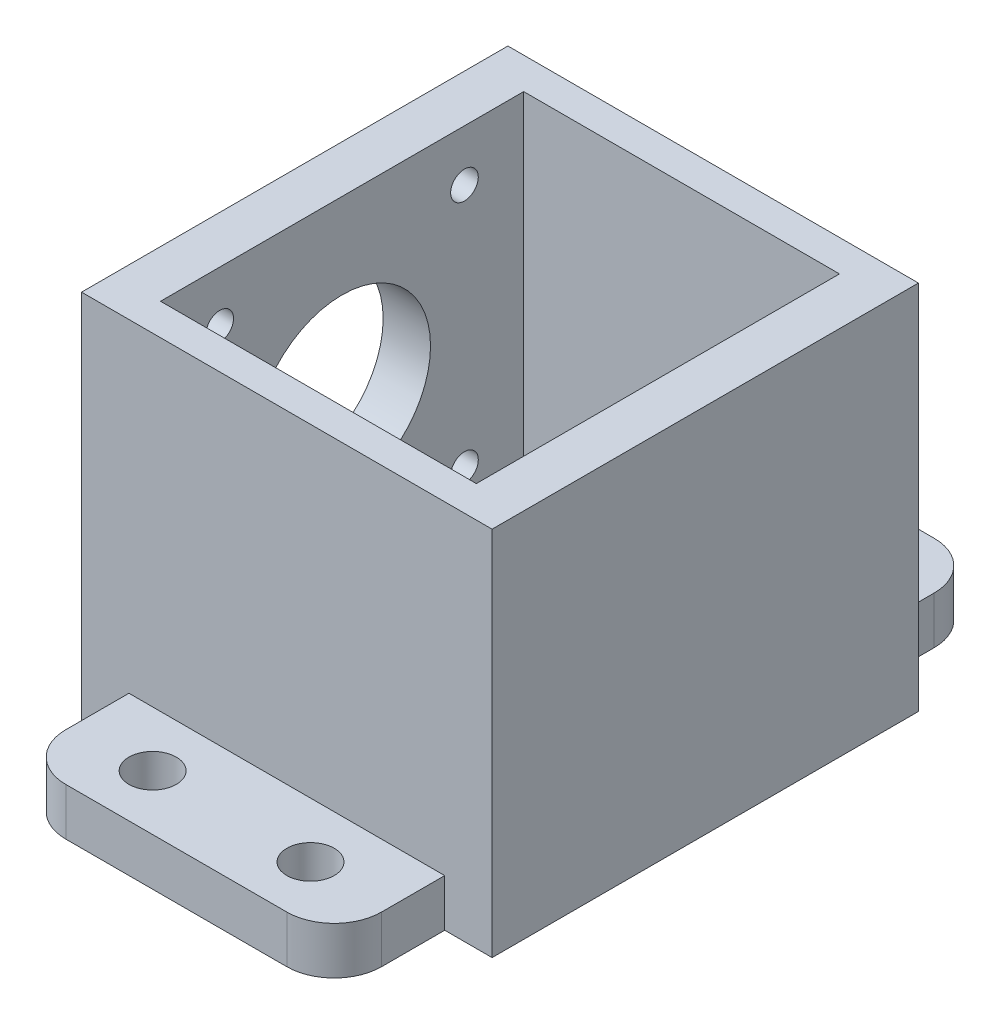
ISO-10303-21;
HEADER;
FILE_DESCRIPTION(('STEP AP214'),'2;1');
FILE_NAME('part.step','',(''),(''),'','','');
FILE_SCHEMA(('AUTOMOTIVE_DESIGN { 1 0 10303 214 1 1 1 1 }'));
ENDSEC;
DATA;
#1=APPLICATION_CONTEXT('core data for automotive mechanical design processes');
#2=APPLICATION_PROTOCOL_DEFINITION('international standard','automotive_design',2000,#1);
#3=PRODUCT_CONTEXT('',#1,'mechanical');
#4=PRODUCT('Part','Part','',(#3));
#5=PRODUCT_RELATED_PRODUCT_CATEGORY('part','',(#4));
#6=PRODUCT_DEFINITION_FORMATION('','',#4);
#7=PRODUCT_DEFINITION_CONTEXT('part definition',#1,'design');
#8=PRODUCT_DEFINITION('design','',#6,#7);
#9=PRODUCT_DEFINITION_SHAPE('','',#8);
#10=(LENGTH_UNIT() NAMED_UNIT(*) SI_UNIT(.MILLI.,.METRE.));
#11=(NAMED_UNIT(*) PLANE_ANGLE_UNIT() SI_UNIT($,.RADIAN.));
#12=(NAMED_UNIT(*) SI_UNIT($,.STERADIAN.) SOLID_ANGLE_UNIT());
#13=UNCERTAINTY_MEASURE_WITH_UNIT(LENGTH_MEASURE(1.E-05),#10,'distance_accuracy_value','');
#14=(GEOMETRIC_REPRESENTATION_CONTEXT(3) GLOBAL_UNCERTAINTY_ASSIGNED_CONTEXT((#13)) GLOBAL_UNIT_ASSIGNED_CONTEXT((#10,
#11,#12)) REPRESENTATION_CONTEXT('',''));
#15=CARTESIAN_POINT('',(0.,0.,0.));
#16=DIRECTION('',(0.,0.,1.));
#17=DIRECTION('',(1.,0.,0.));
#18=AXIS2_PLACEMENT_3D('',#15,#16,#17);
#19=CARTESIAN_POINT('',(-26.,47.,27.));
#20=DIRECTION('',(0.,0.,-1.));
#21=DIRECTION('',(-1.,0.,0.));
#22=AXIS2_PLACEMENT_3D('',#19,#20,#21);
#23=PLANE('',#22);
#24=DIRECTION('',(0.,-1.,0.));
#25=VECTOR('',#24,1.);
#26=CARTESIAN_POINT('',(-20.,6.,27.));
#27=LINE('',#26,#25);
#28=CARTESIAN_POINT('',(-20.,6.,27.));
#29=VERTEX_POINT('',#28);
#30=CARTESIAN_POINT('',(-20.,0.,27.));
#31=VERTEX_POINT('',#30);
#32=EDGE_CURVE('E197',#29,#31,#27,.T.);
#33=ORIENTED_EDGE('',*,*,#32,.F.);
#34=DIRECTION('',(-1.,0.,0.));
#35=VECTOR('',#34,1.);
#36=CARTESIAN_POINT('',(-20.,6.,27.));
#37=LINE('',#36,#35);
#38=CARTESIAN_POINT('',(20.,6.,27.));
#39=VERTEX_POINT('',#38);
#40=EDGE_CURVE('E180',#39,#29,#37,.T.);
#41=ORIENTED_EDGE('',*,*,#40,.F.);
#42=DIRECTION('',(0.,-1.,0.));
#43=VECTOR('',#42,1.);
#44=CARTESIAN_POINT('',(20.,6.,27.));
#45=LINE('',#44,#43);
#46=CARTESIAN_POINT('',(20.,0.,27.));
#47=VERTEX_POINT('',#46);
#48=EDGE_CURVE('E190',#39,#47,#45,.T.);
#49=ORIENTED_EDGE('',*,*,#48,.T.);
#50=DIRECTION('',(1.,0.,0.));
#51=VECTOR('',#50,1.);
#52=CARTESIAN_POINT('',(-26.,0.,27.));
#53=LINE('',#52,#51);
#54=CARTESIAN_POINT('',(26.,0.,27.));
#55=VERTEX_POINT('',#54);
#56=EDGE_CURVE('E321',#47,#55,#53,.T.);
#57=ORIENTED_EDGE('',*,*,#56,.T.);
#58=DIRECTION('',(0.,-1.,0.));
#59=VECTOR('',#58,1.);
#60=CARTESIAN_POINT('',(26.,47.,27.));
#61=LINE('',#60,#59);
#62=CARTESIAN_POINT('',(26.,47.,27.));
#63=VERTEX_POINT('',#62);
#64=EDGE_CURVE('E334',#63,#55,#61,.T.);
#65=ORIENTED_EDGE('',*,*,#64,.F.);
#66=DIRECTION('',(1.,0.,0.));
#67=VECTOR('',#66,1.);
#68=CARTESIAN_POINT('',(-26.,47.,27.));
#69=LINE('',#68,#67);
#70=CARTESIAN_POINT('',(-26.,47.,27.));
#71=VERTEX_POINT('',#70);
#72=EDGE_CURVE('E311',#71,#63,#69,.T.);
#73=ORIENTED_EDGE('',*,*,#72,.F.);
#74=DIRECTION('',(0.,-1.,0.));
#75=VECTOR('',#74,1.);
#76=CARTESIAN_POINT('',(-26.,47.,27.));
#77=LINE('',#76,#75);
#78=CARTESIAN_POINT('',(-26.,0.,27.));
#79=VERTEX_POINT('',#78);
#80=EDGE_CURVE('E337',#71,#79,#77,.T.);
#81=ORIENTED_EDGE('',*,*,#80,.T.);
#82=EDGE_CURVE('E322',#79,#31,#53,.T.);
#83=ORIENTED_EDGE('',*,*,#82,.T.);
#84=EDGE_LOOP('',(#33,#41,#49,#57,#65,#73,#81,#83));
#85=FACE_BOUND('',#84,.T.);
#86=ADVANCED_FACE('F35',(#85),#23,.F.);
#87=CARTESIAN_POINT('',(-26.,47.,-27.));
#88=DIRECTION('',(0.,0.,1.));
#89=DIRECTION('',(1.,0.,0.));
#90=AXIS2_PLACEMENT_3D('',#87,#88,#89);
#91=PLANE('',#90);
#92=DIRECTION('',(0.,-1.,0.));
#93=VECTOR('',#92,1.);
#94=CARTESIAN_POINT('',(20.,6.,-27.));
#95=LINE('',#94,#93);
#96=CARTESIAN_POINT('',(20.,6.,-27.));
#97=VERTEX_POINT('',#96);
#98=CARTESIAN_POINT('',(20.,0.,-27.));
#99=VERTEX_POINT('',#98);
#100=EDGE_CURVE('E235',#97,#99,#95,.T.);
#101=ORIENTED_EDGE('',*,*,#100,.F.);
#102=DIRECTION('',(1.,0.,0.));
#103=VECTOR('',#102,1.);
#104=CARTESIAN_POINT('',(-20.,6.,-27.));
#105=LINE('',#104,#103);
#106=CARTESIAN_POINT('',(-20.,6.,-27.));
#107=VERTEX_POINT('',#106);
#108=EDGE_CURVE('E228',#107,#97,#105,.T.);
#109=ORIENTED_EDGE('',*,*,#108,.F.);
#110=DIRECTION('',(0.,-1.,0.));
#111=VECTOR('',#110,1.);
#112=CARTESIAN_POINT('',(-20.,6.,-27.));
#113=LINE('',#112,#111);
#114=CARTESIAN_POINT('',(-20.,0.,-27.));
#115=VERTEX_POINT('',#114);
#116=EDGE_CURVE('E242',#107,#115,#113,.T.);
#117=ORIENTED_EDGE('',*,*,#116,.T.);
#118=DIRECTION('',(-1.,0.,0.));
#119=VECTOR('',#118,1.);
#120=CARTESIAN_POINT('',(-26.,0.,-27.));
#121=LINE('',#120,#119);
#122=CARTESIAN_POINT('',(-26.,0.,-27.));
#123=VERTEX_POINT('',#122);
#124=EDGE_CURVE('E326',#115,#123,#121,.T.);
#125=ORIENTED_EDGE('',*,*,#124,.T.);
#126=DIRECTION('',(0.,-1.,0.));
#127=VECTOR('',#126,1.);
#128=CARTESIAN_POINT('',(-26.,47.,-27.));
#129=LINE('',#128,#127);
#130=CARTESIAN_POINT('',(-26.,47.,-27.));
#131=VERTEX_POINT('',#130);
#132=EDGE_CURVE('E318',#131,#123,#129,.T.);
#133=ORIENTED_EDGE('',*,*,#132,.F.);
#134=DIRECTION('',(-1.,0.,0.));
#135=VECTOR('',#134,1.);
#136=CARTESIAN_POINT('',(-26.,47.,-27.));
#137=LINE('',#136,#135);
#138=CARTESIAN_POINT('',(26.,47.,-27.));
#139=VERTEX_POINT('',#138);
#140=EDGE_CURVE('E316',#139,#131,#137,.T.);
#141=ORIENTED_EDGE('',*,*,#140,.F.);
#142=DIRECTION('',(0.,-1.,0.));
#143=VECTOR('',#142,1.);
#144=CARTESIAN_POINT('',(26.,47.,-27.));
#145=LINE('',#144,#143);
#146=CARTESIAN_POINT('',(26.,0.,-27.));
#147=VERTEX_POINT('',#146);
#148=EDGE_CURVE('E331',#139,#147,#145,.T.);
#149=ORIENTED_EDGE('',*,*,#148,.T.);
#150=EDGE_CURVE('E312',#147,#99,#121,.T.);
#151=ORIENTED_EDGE('',*,*,#150,.T.);
#152=EDGE_LOOP('',(#101,#109,#117,#125,#133,#141,#149,#151));
#153=FACE_BOUND('',#152,.T.);
#154=ADVANCED_FACE('F383',(#153),#91,.F.);
#155=CARTESIAN_POINT('',(-26.,47.,27.));
#156=DIRECTION('',(1.,0.,0.));
#157=DIRECTION('',(0.,0.,-1.));
#158=AXIS2_PLACEMENT_3D('',#155,#156,#157);
#159=PLANE('',#158);
#160=CARTESIAN_POINT('',(-26.,9.5,15.5));
#161=DIRECTION('',(1.,0.,0.));
#162=DIRECTION('',(0.,0.,-1.));
#163=AXIS2_PLACEMENT_3D('',#160,#161,#162);
#164=CIRCLE('',#163,1.75);
#165=CARTESIAN_POINT('',(-26.,9.5,13.75));
#166=VERTEX_POINT('',#165);
#167=EDGE_CURVE('E263',#166,#166,#164,.T.);
#168=ORIENTED_EDGE('',*,*,#167,.T.);
#169=EDGE_LOOP('',(#168));
#170=FACE_BOUND('',#169,.T.);
#171=CARTESIAN_POINT('',(-26.,9.49999999999999,-15.5));
#172=DIRECTION('',(1.,0.,0.));
#173=DIRECTION('',(0.,0.,-1.));
#174=AXIS2_PLACEMENT_3D('',#171,#172,#173);
#175=CIRCLE('',#174,1.75);
#176=CARTESIAN_POINT('',(-26.,9.49999999999999,-17.25));
#177=VERTEX_POINT('',#176);
#178=EDGE_CURVE('E257',#177,#177,#175,.T.);
#179=ORIENTED_EDGE('',*,*,#178,.T.);
#180=EDGE_LOOP('',(#179));
#181=FACE_BOUND('',#180,.T.);
#182=CARTESIAN_POINT('',(-26.,40.5,-15.5));
#183=DIRECTION('',(1.,0.,0.));
#184=DIRECTION('',(0.,0.,-1.));
#185=AXIS2_PLACEMENT_3D('',#182,#183,#184);
#186=CIRCLE('',#185,1.75);
#187=CARTESIAN_POINT('',(-26.,40.5,-17.25));
#188=VERTEX_POINT('',#187);
#189=EDGE_CURVE('E250',#188,#188,#186,.T.);
#190=ORIENTED_EDGE('',*,*,#189,.T.);
#191=EDGE_LOOP('',(#190));
#192=FACE_BOUND('',#191,.T.);
#193=CARTESIAN_POINT('',(-26.,40.5,15.5));
#194=DIRECTION('',(1.,0.,0.));
#195=DIRECTION('',(0.,0.,-1.));
#196=AXIS2_PLACEMENT_3D('',#193,#194,#195);
#197=CIRCLE('',#196,1.75);
#198=CARTESIAN_POINT('',(-26.,40.5,13.75));
#199=VERTEX_POINT('',#198);
#200=EDGE_CURVE('E249',#199,#199,#197,.T.);
#201=ORIENTED_EDGE('',*,*,#200,.T.);
#202=EDGE_LOOP('',(#201));
#203=FACE_BOUND('',#202,.T.);
#204=CARTESIAN_POINT('',(-26.,25.,0.));
#205=DIRECTION('',(1.,0.,0.));
#206=DIRECTION('',(0.,0.,-1.));
#207=AXIS2_PLACEMENT_3D('',#204,#205,#206);
#208=CIRCLE('',#207,11.2);
#209=CARTESIAN_POINT('',(-26.,25.,-11.2));
#210=VERTEX_POINT('',#209);
#211=EDGE_CURVE('E272',#210,#210,#208,.T.);
#212=ORIENTED_EDGE('',*,*,#211,.T.);
#213=EDGE_LOOP('',(#212));
#214=FACE_BOUND('',#213,.T.);
#215=DIRECTION('',(0.,0.,1.));
#216=VECTOR('',#215,1.);
#217=CARTESIAN_POINT('',(-26.,0.,27.));
#218=LINE('',#217,#216);
#219=EDGE_CURVE('E301',#123,#79,#218,.T.);
#220=ORIENTED_EDGE('',*,*,#219,.T.);
#221=ORIENTED_EDGE('',*,*,#80,.F.);
#222=DIRECTION('',(0.,0.,1.));
#223=VECTOR('',#222,1.);
#224=CARTESIAN_POINT('',(-26.,47.,27.));
#225=LINE('',#224,#223);
#226=EDGE_CURVE('E308',#131,#71,#225,.T.);
#227=ORIENTED_EDGE('',*,*,#226,.F.);
#228=ORIENTED_EDGE('',*,*,#132,.T.);
#229=EDGE_LOOP('',(#220,#221,#227,#228));
#230=FACE_BOUND('',#229,.T.);
#231=ADVANCED_FACE('F388',(#170,#181,#192,#203,#214,#230),#159,.F.);
#232=CARTESIAN_POINT('',(26.,47.,27.));
#233=DIRECTION('',(-1.,0.,0.));
#234=DIRECTION('',(0.,0.,1.));
#235=AXIS2_PLACEMENT_3D('',#232,#233,#234);
#236=PLANE('',#235);
#237=DIRECTION('',(0.,0.,-1.));
#238=VECTOR('',#237,1.);
#239=CARTESIAN_POINT('',(26.,0.,27.));
#240=LINE('',#239,#238);
#241=EDGE_CURVE('E324',#55,#147,#240,.T.);
#242=ORIENTED_EDGE('',*,*,#241,.T.);
#243=ORIENTED_EDGE('',*,*,#148,.F.);
#244=DIRECTION('',(0.,0.,-1.));
#245=VECTOR('',#244,1.);
#246=CARTESIAN_POINT('',(26.,47.,27.));
#247=LINE('',#246,#245);
#248=EDGE_CURVE('E314',#63,#139,#247,.T.);
#249=ORIENTED_EDGE('',*,*,#248,.F.);
#250=ORIENTED_EDGE('',*,*,#64,.T.);
#251=EDGE_LOOP('',(#242,#243,#249,#250));
#252=FACE_BOUND('',#251,.T.);
#253=ADVANCED_FACE('F427',(#252),#236,.F.);
#254=CARTESIAN_POINT('',(0.,47.,0.));
#255=DIRECTION('',(0.,-1.,0.));
#256=DIRECTION('',(0.,0.,-1.));
#257=AXIS2_PLACEMENT_3D('',#254,#255,#256);
#258=PLANE('',#257);
#259=DIRECTION('',(1.,0.,0.));
#260=VECTOR('',#259,1.);
#261=CARTESIAN_POINT('',(0.,47.,23.));
#262=LINE('',#261,#260);
#263=CARTESIAN_POINT('',(-20.,47.,23.));
#264=VERTEX_POINT('',#263);
#265=CARTESIAN_POINT('',(20.,47.,23.));
#266=VERTEX_POINT('',#265);
#267=EDGE_CURVE('E291',#264,#266,#262,.T.);
#268=ORIENTED_EDGE('',*,*,#267,.F.);
#269=DIRECTION('',(0.,0.,1.));
#270=VECTOR('',#269,1.);
#271=CARTESIAN_POINT('',(-20.,47.,0.));
#272=LINE('',#271,#270);
#273=CARTESIAN_POINT('',(-20.,47.,-23.));
#274=VERTEX_POINT('',#273);
#275=EDGE_CURVE('E275',#274,#264,#272,.T.);
#276=ORIENTED_EDGE('',*,*,#275,.F.);
#277=DIRECTION('',(-1.,0.,0.));
#278=VECTOR('',#277,1.);
#279=CARTESIAN_POINT('',(0.,47.,-23.));
#280=LINE('',#279,#278);
#281=CARTESIAN_POINT('',(20.,47.,-23.));
#282=VERTEX_POINT('',#281);
#283=EDGE_CURVE('E280',#282,#274,#280,.T.);
#284=ORIENTED_EDGE('',*,*,#283,.F.);
#285=DIRECTION('',(0.,0.,-1.));
#286=VECTOR('',#285,1.);
#287=CARTESIAN_POINT('',(20.,47.,0.));
#288=LINE('',#287,#286);
#289=EDGE_CURVE('E294',#266,#282,#288,.T.);
#290=ORIENTED_EDGE('',*,*,#289,.F.);
#291=EDGE_LOOP('',(#268,#276,#284,#290));
#292=FACE_BOUND('',#291,.T.);
#293=ORIENTED_EDGE('',*,*,#226,.T.);
#294=ORIENTED_EDGE('',*,*,#72,.T.);
#295=ORIENTED_EDGE('',*,*,#248,.T.);
#296=ORIENTED_EDGE('',*,*,#140,.T.);
#297=EDGE_LOOP('',(#293,#294,#295,#296));
#298=FACE_BOUND('',#297,.T.);
#299=ADVANCED_FACE('F391',(#292,#298),#258,.F.);
#300=CARTESIAN_POINT('',(0.,0.,0.));
#301=DIRECTION('',(0.,-1.,0.));
#302=DIRECTION('',(0.,0.,-1.));
#303=AXIS2_PLACEMENT_3D('',#300,#301,#302);
#304=PLANE('',#303);
#305=DIRECTION('',(1.,0.,0.));
#306=VECTOR('',#305,1.);
#307=CARTESIAN_POINT('',(-20.,0.,41.));
#308=LINE('',#307,#306);
#309=CARTESIAN_POINT('',(-14.,0.,41.));
#310=VERTEX_POINT('',#309);
#311=CARTESIAN_POINT('',(14.,0.,41.));
#312=VERTEX_POINT('',#311);
#313=EDGE_CURVE('E208',#310,#312,#308,.T.);
#314=ORIENTED_EDGE('',*,*,#313,.F.);
#315=CARTESIAN_POINT('',(-14.,0.,35.));
#316=DIRECTION('',(0.,-1.,0.));
#317=DIRECTION('',(0.,0.,-1.));
#318=AXIS2_PLACEMENT_3D('',#315,#316,#317);
#319=CIRCLE('',#318,6.);
#320=CARTESIAN_POINT('',(-20.,0.,35.));
#321=VERTEX_POINT('',#320);
#322=EDGE_CURVE('E351',#310,#321,#319,.T.);
#323=ORIENTED_EDGE('',*,*,#322,.T.);
#324=DIRECTION('',(0.,0.,1.));
#325=VECTOR('',#324,1.);
#326=CARTESIAN_POINT('',(-20.,0.,27.));
#327=LINE('',#326,#325);
#328=EDGE_CURVE('E205',#31,#321,#327,.T.);
#329=ORIENTED_EDGE('',*,*,#328,.F.);
#330=ORIENTED_EDGE('',*,*,#82,.F.);
#331=ORIENTED_EDGE('',*,*,#219,.F.);
#332=ORIENTED_EDGE('',*,*,#124,.F.);
#333=DIRECTION('',(0.,0.,1.));
#334=VECTOR('',#333,1.);
#335=CARTESIAN_POINT('',(-20.,0.,-27.));
#336=LINE('',#335,#334);
#337=CARTESIAN_POINT('',(-20.,0.,-35.));
#338=VERTEX_POINT('',#337);
#339=EDGE_CURVE('E223',#338,#115,#336,.T.);
#340=ORIENTED_EDGE('',*,*,#339,.F.);
#341=CARTESIAN_POINT('',(-14.,0.,-35.));
#342=DIRECTION('',(0.,-1.,0.));
#343=DIRECTION('',(0.,0.,-1.));
#344=AXIS2_PLACEMENT_3D('',#341,#342,#343);
#345=CIRCLE('',#344,6.);
#346=CARTESIAN_POINT('',(-14.,0.,-41.));
#347=VERTEX_POINT('',#346);
#348=EDGE_CURVE('E347',#338,#347,#345,.T.);
#349=ORIENTED_EDGE('',*,*,#348,.T.);
#350=DIRECTION('',(-1.,0.,0.));
#351=VECTOR('',#350,1.);
#352=CARTESIAN_POINT('',(-20.,0.,-41.));
#353=LINE('',#352,#351);
#354=CARTESIAN_POINT('',(14.,0.,-41.));
#355=VERTEX_POINT('',#354);
#356=EDGE_CURVE('E229',#355,#347,#353,.T.);
#357=ORIENTED_EDGE('',*,*,#356,.F.);
#358=CARTESIAN_POINT('',(14.,0.,-35.));
#359=DIRECTION('',(0.,-1.,0.));
#360=DIRECTION('',(0.,0.,-1.));
#361=AXIS2_PLACEMENT_3D('',#358,#359,#360);
#362=CIRCLE('',#361,6.);
#363=CARTESIAN_POINT('',(20.,0.,-35.));
#364=VERTEX_POINT('',#363);
#365=EDGE_CURVE('E349',#355,#364,#362,.T.);
#366=ORIENTED_EDGE('',*,*,#365,.T.);
#367=DIRECTION('',(0.,0.,-1.));
#368=VECTOR('',#367,1.);
#369=CARTESIAN_POINT('',(20.,0.,-27.));
#370=LINE('',#369,#368);
#371=EDGE_CURVE('E237',#99,#364,#370,.T.);
#372=ORIENTED_EDGE('',*,*,#371,.F.);
#373=ORIENTED_EDGE('',*,*,#150,.F.);
#374=ORIENTED_EDGE('',*,*,#241,.F.);
#375=ORIENTED_EDGE('',*,*,#56,.F.);
#376=DIRECTION('',(0.,0.,-1.));
#377=VECTOR('',#376,1.);
#378=CARTESIAN_POINT('',(20.,0.,27.));
#379=LINE('',#378,#377);
#380=CARTESIAN_POINT('',(20.,0.,35.));
#381=VERTEX_POINT('',#380);
#382=EDGE_CURVE('E193',#381,#47,#379,.T.);
#383=ORIENTED_EDGE('',*,*,#382,.F.);
#384=CARTESIAN_POINT('',(14.,0.,35.));
#385=DIRECTION('',(0.,-1.,0.));
#386=DIRECTION('',(0.,0.,-1.));
#387=AXIS2_PLACEMENT_3D('',#384,#385,#386);
#388=CIRCLE('',#387,6.);
#389=EDGE_CURVE('E345',#381,#312,#388,.T.);
#390=ORIENTED_EDGE('',*,*,#389,.T.);
#391=EDGE_LOOP('',(#314,#323,#329,#330,#331,#332,#340,#349,#357,#366,#372,#373,#374,#375,#383,#390));
#392=FACE_BOUND('',#391,.T.);
#393=CARTESIAN_POINT('',(-9.99999999999999,0.,-34.));
#394=DIRECTION('',(0.,1.,0.));
#395=DIRECTION('',(0.,0.,1.));
#396=AXIS2_PLACEMENT_3D('',#393,#394,#395);
#397=CIRCLE('',#396,3.);
#398=CARTESIAN_POINT('',(-9.99999999999999,0.,-31.));
#399=VERTEX_POINT('',#398);
#400=EDGE_CURVE('E217',#399,#399,#397,.T.);
#401=ORIENTED_EDGE('',*,*,#400,.T.);
#402=EDGE_LOOP('',(#401));
#403=FACE_BOUND('',#402,.T.);
#404=CARTESIAN_POINT('',(10.,0.,-34.));
#405=DIRECTION('',(0.,1.,0.));
#406=DIRECTION('',(0.,0.,1.));
#407=AXIS2_PLACEMENT_3D('',#404,#405,#406);
#408=CIRCLE('',#407,3.);
#409=CARTESIAN_POINT('',(10.,0.,-31.));
#410=VERTEX_POINT('',#409);
#411=EDGE_CURVE('E196',#410,#410,#408,.T.);
#412=ORIENTED_EDGE('',*,*,#411,.T.);
#413=EDGE_LOOP('',(#412));
#414=FACE_BOUND('',#413,.T.);
#415=CARTESIAN_POINT('',(10.,0.,34.));
#416=DIRECTION('',(0.,1.,0.));
#417=DIRECTION('',(0.,0.,-1.));
#418=AXIS2_PLACEMENT_3D('',#415,#416,#417);
#419=CIRCLE('',#418,3.);
#420=CARTESIAN_POINT('',(10.,0.,31.));
#421=VERTEX_POINT('',#420);
#422=EDGE_CURVE('E449',#421,#421,#419,.T.);
#423=ORIENTED_EDGE('',*,*,#422,.T.);
#424=EDGE_LOOP('',(#423));
#425=FACE_BOUND('',#424,.T.);
#426=CARTESIAN_POINT('',(-9.99999999999999,0.,34.));
#427=DIRECTION('',(0.,1.,0.));
#428=DIRECTION('',(0.,0.,-1.));
#429=AXIS2_PLACEMENT_3D('',#426,#427,#428);
#430=CIRCLE('',#429,3.);
#431=CARTESIAN_POINT('',(-9.99999999999999,0.,31.));
#432=VERTEX_POINT('',#431);
#433=EDGE_CURVE('E455',#432,#432,#430,.T.);
#434=ORIENTED_EDGE('',*,*,#433,.T.);
#435=EDGE_LOOP('',(#434));
#436=FACE_BOUND('',#435,.T.);
#437=ADVANCED_FACE('F376',(#392,#403,#414,#425,#436),#304,.T.);
#438=CARTESIAN_POINT('',(-20.,4.,0.));
#439=DIRECTION('',(-1.,0.,0.));
#440=DIRECTION('',(0.,0.,1.));
#441=AXIS2_PLACEMENT_3D('',#438,#439,#440);
#442=PLANE('',#441);
#443=CARTESIAN_POINT('',(-20.,9.5,15.5));
#444=DIRECTION('',(-1.,0.,0.));
#445=DIRECTION('',(0.,0.,1.));
#446=AXIS2_PLACEMENT_3D('',#443,#444,#445);
#447=CIRCLE('',#446,1.75);
#448=CARTESIAN_POINT('',(-20.,9.5,17.25));
#449=VERTEX_POINT('',#448);
#450=EDGE_CURVE('E245',#449,#449,#447,.T.);
#451=ORIENTED_EDGE('',*,*,#450,.T.);
#452=EDGE_LOOP('',(#451));
#453=FACE_BOUND('',#452,.T.);
#454=CARTESIAN_POINT('',(-20.,9.49999999999999,-15.5));
#455=DIRECTION('',(-1.,0.,0.));
#456=DIRECTION('',(0.,0.,1.));
#457=AXIS2_PLACEMENT_3D('',#454,#455,#456);
#458=CIRCLE('',#457,1.75);
#459=CARTESIAN_POINT('',(-20.,9.49999999999999,-13.75));
#460=VERTEX_POINT('',#459);
#461=EDGE_CURVE('E260',#460,#460,#458,.T.);
#462=ORIENTED_EDGE('',*,*,#461,.T.);
#463=EDGE_LOOP('',(#462));
#464=FACE_BOUND('',#463,.T.);
#465=CARTESIAN_POINT('',(-20.,40.5,-15.5));
#466=DIRECTION('',(-1.,0.,0.));
#467=DIRECTION('',(0.,0.,1.));
#468=AXIS2_PLACEMENT_3D('',#465,#466,#467);
#469=CIRCLE('',#468,1.75);
#470=CARTESIAN_POINT('',(-20.,40.5,-13.75));
#471=VERTEX_POINT('',#470);
#472=EDGE_CURVE('E254',#471,#471,#469,.T.);
#473=ORIENTED_EDGE('',*,*,#472,.T.);
#474=EDGE_LOOP('',(#473));
#475=FACE_BOUND('',#474,.T.);
#476=CARTESIAN_POINT('',(-20.,40.5,15.5));
#477=DIRECTION('',(-1.,0.,0.));
#478=DIRECTION('',(0.,0.,1.));
#479=AXIS2_PLACEMENT_3D('',#476,#477,#478);
#480=CIRCLE('',#479,1.75);
#481=CARTESIAN_POINT('',(-20.,40.5,17.25));
#482=VERTEX_POINT('',#481);
#483=EDGE_CURVE('E246',#482,#482,#480,.T.);
#484=ORIENTED_EDGE('',*,*,#483,.T.);
#485=EDGE_LOOP('',(#484));
#486=FACE_BOUND('',#485,.T.);
#487=CARTESIAN_POINT('',(-20.,25.,0.));
#488=DIRECTION('',(-1.,0.,0.));
#489=DIRECTION('',(0.,0.,1.));
#490=AXIS2_PLACEMENT_3D('',#487,#488,#489);
#491=CIRCLE('',#490,11.2);
#492=CARTESIAN_POINT('',(-20.,25.,11.2));
#493=VERTEX_POINT('',#492);
#494=EDGE_CURVE('E253',#493,#493,#491,.T.);
#495=ORIENTED_EDGE('',*,*,#494,.T.);
#496=EDGE_LOOP('',(#495));
#497=FACE_BOUND('',#496,.T.);
#498=ORIENTED_EDGE('',*,*,#275,.T.);
#499=DIRECTION('',(0.,1.,0.));
#500=VECTOR('',#499,1.);
#501=CARTESIAN_POINT('',(-20.,4.,23.));
#502=LINE('',#501,#500);
#503=CARTESIAN_POINT('',(-20.,4.,23.));
#504=VERTEX_POINT('',#503);
#505=EDGE_CURVE('E289',#504,#264,#502,.T.);
#506=ORIENTED_EDGE('',*,*,#505,.F.);
#507=DIRECTION('',(0.,0.,1.));
#508=VECTOR('',#507,1.);
#509=CARTESIAN_POINT('',(-20.,4.,0.));
#510=LINE('',#509,#508);
#511=CARTESIAN_POINT('',(-20.,4.,-23.));
#512=VERTEX_POINT('',#511);
#513=EDGE_CURVE('E276',#512,#504,#510,.T.);
#514=ORIENTED_EDGE('',*,*,#513,.F.);
#515=DIRECTION('',(0.,1.,0.));
#516=VECTOR('',#515,1.);
#517=CARTESIAN_POINT('',(-20.,4.,-23.));
#518=LINE('',#517,#516);
#519=EDGE_CURVE('E299',#512,#274,#518,.T.);
#520=ORIENTED_EDGE('',*,*,#519,.T.);
#521=EDGE_LOOP('',(#498,#506,#514,#520));
#522=FACE_BOUND('',#521,.T.);
#523=ADVANCED_FACE('F522',(#453,#464,#475,#486,#497,#522),#442,.F.);
#524=CARTESIAN_POINT('',(0.,4.,-23.));
#525=DIRECTION('',(0.,0.,-1.));
#526=DIRECTION('',(-1.,0.,0.));
#527=AXIS2_PLACEMENT_3D('',#524,#525,#526);
#528=PLANE('',#527);
#529=ORIENTED_EDGE('',*,*,#283,.T.);
#530=ORIENTED_EDGE('',*,*,#519,.F.);
#531=DIRECTION('',(-1.,0.,0.));
#532=VECTOR('',#531,1.);
#533=CARTESIAN_POINT('',(0.,4.,-23.));
#534=LINE('',#533,#532);
#535=CARTESIAN_POINT('',(20.,4.,-23.));
#536=VERTEX_POINT('',#535);
#537=EDGE_CURVE('E286',#536,#512,#534,.T.);
#538=ORIENTED_EDGE('',*,*,#537,.F.);
#539=DIRECTION('',(0.,1.,0.));
#540=VECTOR('',#539,1.);
#541=CARTESIAN_POINT('',(20.,4.,-23.));
#542=LINE('',#541,#540);
#543=EDGE_CURVE('E302',#536,#282,#542,.T.);
#544=ORIENTED_EDGE('',*,*,#543,.T.);
#545=EDGE_LOOP('',(#529,#530,#538,#544));
#546=FACE_BOUND('',#545,.T.);
#547=ADVANCED_FACE('F518',(#546),#528,.F.);
#548=CARTESIAN_POINT('',(20.,4.,0.));
#549=DIRECTION('',(1.,0.,0.));
#550=DIRECTION('',(0.,0.,-1.));
#551=AXIS2_PLACEMENT_3D('',#548,#549,#550);
#552=PLANE('',#551);
#553=ORIENTED_EDGE('',*,*,#289,.T.);
#554=ORIENTED_EDGE('',*,*,#543,.F.);
#555=DIRECTION('',(0.,0.,-1.));
#556=VECTOR('',#555,1.);
#557=CARTESIAN_POINT('',(20.,4.,0.));
#558=LINE('',#557,#556);
#559=CARTESIAN_POINT('',(20.,4.,23.));
#560=VERTEX_POINT('',#559);
#561=EDGE_CURVE('E283',#560,#536,#558,.T.);
#562=ORIENTED_EDGE('',*,*,#561,.F.);
#563=DIRECTION('',(0.,1.,0.));
#564=VECTOR('',#563,1.);
#565=CARTESIAN_POINT('',(20.,4.,23.));
#566=LINE('',#565,#564);
#567=EDGE_CURVE('E304',#560,#266,#566,.T.);
#568=ORIENTED_EDGE('',*,*,#567,.T.);
#569=EDGE_LOOP('',(#553,#554,#562,#568));
#570=FACE_BOUND('',#569,.T.);
#571=ADVANCED_FACE('F521',(#570),#552,.F.);
#572=CARTESIAN_POINT('',(0.,4.,23.));
#573=DIRECTION('',(0.,0.,1.));
#574=DIRECTION('',(1.,0.,0.));
#575=AXIS2_PLACEMENT_3D('',#572,#573,#574);
#576=PLANE('',#575);
#577=ORIENTED_EDGE('',*,*,#267,.T.);
#578=ORIENTED_EDGE('',*,*,#567,.F.);
#579=DIRECTION('',(1.,0.,0.));
#580=VECTOR('',#579,1.);
#581=CARTESIAN_POINT('',(0.,4.,23.));
#582=LINE('',#581,#580);
#583=EDGE_CURVE('E279',#504,#560,#582,.T.);
#584=ORIENTED_EDGE('',*,*,#583,.F.);
#585=ORIENTED_EDGE('',*,*,#505,.T.);
#586=EDGE_LOOP('',(#577,#578,#584,#585));
#587=FACE_BOUND('',#586,.T.);
#588=ADVANCED_FACE('F516',(#587),#576,.F.);
#589=CARTESIAN_POINT('',(0.,4.,0.));
#590=DIRECTION('',(0.,1.,0.));
#591=DIRECTION('',(0.,0.,1.));
#592=AXIS2_PLACEMENT_3D('',#589,#590,#591);
#593=PLANE('',#592);
#594=ORIENTED_EDGE('',*,*,#513,.T.);
#595=ORIENTED_EDGE('',*,*,#583,.T.);
#596=ORIENTED_EDGE('',*,*,#561,.T.);
#597=ORIENTED_EDGE('',*,*,#537,.T.);
#598=EDGE_LOOP('',(#594,#595,#596,#597));
#599=FACE_BOUND('',#598,.T.);
#600=ADVANCED_FACE('F512',(#599),#593,.T.);
#601=CARTESIAN_POINT('',(-57.6783837971573,25.,0.));
#602=DIRECTION('',(1.,0.,0.));
#603=DIRECTION('',(0.,0.,-1.));
#604=AXIS2_PLACEMENT_3D('',#601,#602,#603);
#605=CYLINDRICAL_SURFACE('',#604,11.2);
#606=ORIENTED_EDGE('',*,*,#211,.F.);
#607=EDGE_LOOP('',(#606));
#608=FACE_BOUND('',#607,.T.);
#609=ORIENTED_EDGE('',*,*,#494,.F.);
#610=EDGE_LOOP('',(#609));
#611=FACE_BOUND('',#610,.T.);
#612=ADVANCED_FACE('F498',(#608,#611),#605,.F.);
#613=CARTESIAN_POINT('',(-57.6783837971573,40.5,15.5));
#614=DIRECTION('',(1.,0.,0.));
#615=DIRECTION('',(0.,0.,-1.));
#616=AXIS2_PLACEMENT_3D('',#613,#614,#615);
#617=CYLINDRICAL_SURFACE('',#616,1.75);
#618=ORIENTED_EDGE('',*,*,#200,.F.);
#619=EDGE_LOOP('',(#618));
#620=FACE_BOUND('',#619,.T.);
#621=ORIENTED_EDGE('',*,*,#483,.F.);
#622=EDGE_LOOP('',(#621));
#623=FACE_BOUND('',#622,.T.);
#624=ADVANCED_FACE('F494',(#620,#623),#617,.F.);
#625=CARTESIAN_POINT('',(-57.6783837971573,40.5,-15.5));
#626=DIRECTION('',(1.,0.,0.));
#627=DIRECTION('',(0.,0.,-1.));
#628=AXIS2_PLACEMENT_3D('',#625,#626,#627);
#629=CYLINDRICAL_SURFACE('',#628,1.75);
#630=ORIENTED_EDGE('',*,*,#189,.F.);
#631=EDGE_LOOP('',(#630));
#632=FACE_BOUND('',#631,.T.);
#633=ORIENTED_EDGE('',*,*,#472,.F.);
#634=EDGE_LOOP('',(#633));
#635=FACE_BOUND('',#634,.T.);
#636=ADVANCED_FACE('F497',(#632,#635),#629,.F.);
#637=CARTESIAN_POINT('',(-57.6783837971573,9.49999999999999,-15.5));
#638=DIRECTION('',(1.,0.,0.));
#639=DIRECTION('',(0.,0.,-1.));
#640=AXIS2_PLACEMENT_3D('',#637,#638,#639);
#641=CYLINDRICAL_SURFACE('',#640,1.75);
#642=ORIENTED_EDGE('',*,*,#178,.F.);
#643=EDGE_LOOP('',(#642));
#644=FACE_BOUND('',#643,.T.);
#645=ORIENTED_EDGE('',*,*,#461,.F.);
#646=EDGE_LOOP('',(#645));
#647=FACE_BOUND('',#646,.T.);
#648=ADVANCED_FACE('F502',(#644,#647),#641,.F.);
#649=CARTESIAN_POINT('',(-57.6783837971573,9.5,15.5));
#650=DIRECTION('',(1.,0.,0.));
#651=DIRECTION('',(0.,0.,-1.));
#652=AXIS2_PLACEMENT_3D('',#649,#650,#651);
#653=CYLINDRICAL_SURFACE('',#652,1.75);
#654=ORIENTED_EDGE('',*,*,#167,.F.);
#655=EDGE_LOOP('',(#654));
#656=FACE_BOUND('',#655,.T.);
#657=ORIENTED_EDGE('',*,*,#450,.F.);
#658=EDGE_LOOP('',(#657));
#659=FACE_BOUND('',#658,.T.);
#660=ADVANCED_FACE('F487',(#656,#659),#653,.F.);
#661=CARTESIAN_POINT('',(0.,6.,0.));
#662=DIRECTION('',(0.,-1.,0.));
#663=DIRECTION('',(0.,0.,-1.));
#664=AXIS2_PLACEMENT_3D('',#661,#662,#663);
#665=PLANE('',#664);
#666=DIRECTION('',(0.,0.,-1.));
#667=VECTOR('',#666,1.);
#668=CARTESIAN_POINT('',(20.,6.,-27.));
#669=LINE('',#668,#667);
#670=CARTESIAN_POINT('',(20.,6.,-35.));
#671=VERTEX_POINT('',#670);
#672=EDGE_CURVE('E231',#97,#671,#669,.T.);
#673=ORIENTED_EDGE('',*,*,#672,.T.);
#674=CARTESIAN_POINT('',(14.,6.,-35.));
#675=DIRECTION('',(0.,-1.,0.));
#676=DIRECTION('',(0.,0.,-1.));
#677=AXIS2_PLACEMENT_3D('',#674,#675,#676);
#678=CIRCLE('',#677,6.);
#679=CARTESIAN_POINT('',(14.,6.,-41.));
#680=VERTEX_POINT('',#679);
#681=EDGE_CURVE('E365',#671,#680,#678,.F.);
#682=ORIENTED_EDGE('',*,*,#681,.T.);
#683=DIRECTION('',(-1.,0.,0.));
#684=VECTOR('',#683,1.);
#685=CARTESIAN_POINT('',(-20.,6.,-41.));
#686=LINE('',#685,#684);
#687=CARTESIAN_POINT('',(-14.,6.,-41.));
#688=VERTEX_POINT('',#687);
#689=EDGE_CURVE('E233',#680,#688,#686,.T.);
#690=ORIENTED_EDGE('',*,*,#689,.T.);
#691=CARTESIAN_POINT('',(-14.,6.,-35.));
#692=DIRECTION('',(0.,-1.,0.));
#693=DIRECTION('',(0.,0.,-1.));
#694=AXIS2_PLACEMENT_3D('',#691,#692,#693);
#695=CIRCLE('',#694,6.);
#696=CARTESIAN_POINT('',(-20.,6.,-35.));
#697=VERTEX_POINT('',#696);
#698=EDGE_CURVE('E50',#688,#697,#695,.F.);
#699=ORIENTED_EDGE('',*,*,#698,.T.);
#700=DIRECTION('',(0.,0.,1.));
#701=VECTOR('',#700,1.);
#702=CARTESIAN_POINT('',(-20.,6.,-27.));
#703=LINE('',#702,#701);
#704=EDGE_CURVE('E226',#697,#107,#703,.T.);
#705=ORIENTED_EDGE('',*,*,#704,.T.);
#706=ORIENTED_EDGE('',*,*,#108,.T.);
#707=EDGE_LOOP('',(#673,#682,#690,#699,#705,#706));
#708=FACE_BOUND('',#707,.T.);
#709=CARTESIAN_POINT('',(-9.99999999999999,6.,-34.));
#710=DIRECTION('',(0.,1.,0.));
#711=DIRECTION('',(0.,0.,1.));
#712=AXIS2_PLACEMENT_3D('',#709,#710,#711);
#713=CIRCLE('',#712,3.);
#714=CARTESIAN_POINT('',(-9.99999999999999,6.,-31.));
#715=VERTEX_POINT('',#714);
#716=EDGE_CURVE('E220',#715,#715,#713,.T.);
#717=ORIENTED_EDGE('',*,*,#716,.F.);
#718=EDGE_LOOP('',(#717));
#719=FACE_BOUND('',#718,.T.);
#720=CARTESIAN_POINT('',(10.,6.,-34.));
#721=DIRECTION('',(0.,1.,0.));
#722=DIRECTION('',(0.,0.,1.));
#723=AXIS2_PLACEMENT_3D('',#720,#721,#722);
#724=CIRCLE('',#723,3.);
#725=CARTESIAN_POINT('',(10.,6.,-31.));
#726=VERTEX_POINT('',#725);
#727=EDGE_CURVE('E214',#726,#726,#724,.T.);
#728=ORIENTED_EDGE('',*,*,#727,.F.);
#729=EDGE_LOOP('',(#728));
#730=FACE_BOUND('',#729,.T.);
#731=ADVANCED_FACE('F405',(#708,#719,#730),#665,.F.);
#732=CARTESIAN_POINT('',(-20.,6.,-27.));
#733=DIRECTION('',(1.,0.,0.));
#734=DIRECTION('',(0.,0.,-1.));
#735=AXIS2_PLACEMENT_3D('',#732,#733,#734);
#736=PLANE('',#735);
#737=ORIENTED_EDGE('',*,*,#704,.F.);
#738=DIRECTION('',(0.,-1.,0.));
#739=VECTOR('',#738,1.);
#740=CARTESIAN_POINT('',(-20.,6.,-35.));
#741=LINE('',#740,#739);
#742=EDGE_CURVE('E43',#697,#338,#741,.T.);
#743=ORIENTED_EDGE('',*,*,#742,.T.);
#744=ORIENTED_EDGE('',*,*,#339,.T.);
#745=ORIENTED_EDGE('',*,*,#116,.F.);
#746=EDGE_LOOP('',(#737,#743,#744,#745));
#747=FACE_BOUND('',#746,.T.);
#748=ADVANCED_FACE('F370',(#747),#736,.F.);
#749=CARTESIAN_POINT('',(20.,6.,-27.));
#750=DIRECTION('',(-1.,0.,0.));
#751=DIRECTION('',(0.,0.,1.));
#752=AXIS2_PLACEMENT_3D('',#749,#750,#751);
#753=PLANE('',#752);
#754=ORIENTED_EDGE('',*,*,#371,.T.);
#755=DIRECTION('',(0.,-1.,0.));
#756=VECTOR('',#755,1.);
#757=CARTESIAN_POINT('',(20.,6.,-35.));
#758=LINE('',#757,#756);
#759=EDGE_CURVE('E58',#364,#671,#758,.F.);
#760=ORIENTED_EDGE('',*,*,#759,.T.);
#761=ORIENTED_EDGE('',*,*,#672,.F.);
#762=ORIENTED_EDGE('',*,*,#100,.T.);
#763=EDGE_LOOP('',(#754,#760,#761,#762));
#764=FACE_BOUND('',#763,.T.);
#765=ADVANCED_FACE('F399',(#764),#753,.F.);
#766=CARTESIAN_POINT('',(-20.,6.,-41.));
#767=DIRECTION('',(0.,0.,1.));
#768=DIRECTION('',(1.,0.,0.));
#769=AXIS2_PLACEMENT_3D('',#766,#767,#768);
#770=PLANE('',#769);
#771=ORIENTED_EDGE('',*,*,#689,.F.);
#772=DIRECTION('',(0.,-1.,0.));
#773=VECTOR('',#772,1.);
#774=CARTESIAN_POINT('',(14.,6.,-41.));
#775=LINE('',#774,#773);
#776=EDGE_CURVE('E360',#680,#355,#775,.T.);
#777=ORIENTED_EDGE('',*,*,#776,.T.);
#778=ORIENTED_EDGE('',*,*,#356,.T.);
#779=DIRECTION('',(0.,-1.,0.));
#780=VECTOR('',#779,1.);
#781=CARTESIAN_POINT('',(-14.,6.,-41.));
#782=LINE('',#781,#780);
#783=EDGE_CURVE('E358',#347,#688,#782,.F.);
#784=ORIENTED_EDGE('',*,*,#783,.T.);
#785=EDGE_LOOP('',(#771,#777,#778,#784));
#786=FACE_BOUND('',#785,.T.);
#787=ADVANCED_FACE('F408',(#786),#770,.F.);
#788=CARTESIAN_POINT('',(-9.99999999999999,6.,-34.));
#789=DIRECTION('',(0.,-1.,0.));
#790=DIRECTION('',(0.,0.,-1.));
#791=AXIS2_PLACEMENT_3D('',#788,#789,#790);
#792=CYLINDRICAL_SURFACE('',#791,3.);
#793=ORIENTED_EDGE('',*,*,#716,.T.);
#794=EDGE_LOOP('',(#793));
#795=FACE_BOUND('',#794,.T.);
#796=ORIENTED_EDGE('',*,*,#400,.F.);
#797=EDGE_LOOP('',(#796));
#798=FACE_BOUND('',#797,.T.);
#799=ADVANCED_FACE('F472',(#795,#798),#792,.F.);
#800=CARTESIAN_POINT('',(10.,6.,-34.));
#801=DIRECTION('',(0.,-1.,0.));
#802=DIRECTION('',(0.,0.,-1.));
#803=AXIS2_PLACEMENT_3D('',#800,#801,#802);
#804=CYLINDRICAL_SURFACE('',#803,3.);
#805=ORIENTED_EDGE('',*,*,#727,.T.);
#806=EDGE_LOOP('',(#805));
#807=FACE_BOUND('',#806,.T.);
#808=ORIENTED_EDGE('',*,*,#411,.F.);
#809=EDGE_LOOP('',(#808));
#810=FACE_BOUND('',#809,.T.);
#811=ADVANCED_FACE('F463',(#807,#810),#804,.F.);
#812=CARTESIAN_POINT('',(0.,6.,0.));
#813=DIRECTION('',(0.,1.,0.));
#814=DIRECTION('',(0.,0.,1.));
#815=AXIS2_PLACEMENT_3D('',#812,#813,#814);
#816=PLANE('',#815);
#817=CARTESIAN_POINT('',(10.,6.,34.));
#818=DIRECTION('',(0.,1.,0.));
#819=DIRECTION('',(0.,0.,-1.));
#820=AXIS2_PLACEMENT_3D('',#817,#818,#819);
#821=CIRCLE('',#820,3.);
#822=CARTESIAN_POINT('',(10.,6.,31.));
#823=VERTEX_POINT('',#822);
#824=EDGE_CURVE('E209',#823,#823,#821,.T.);
#825=ORIENTED_EDGE('',*,*,#824,.F.);
#826=EDGE_LOOP('',(#825));
#827=FACE_BOUND('',#826,.T.);
#828=DIRECTION('',(0.,0.,1.));
#829=VECTOR('',#828,1.);
#830=CARTESIAN_POINT('',(-20.,6.,27.));
#831=LINE('',#830,#829);
#832=CARTESIAN_POINT('',(-20.,6.,35.));
#833=VERTEX_POINT('',#832);
#834=EDGE_CURVE('E212',#29,#833,#831,.T.);
#835=ORIENTED_EDGE('',*,*,#834,.T.);
#836=CARTESIAN_POINT('',(-14.,6.,35.));
#837=DIRECTION('',(0.,1.,0.));
#838=DIRECTION('',(0.,0.,1.));
#839=AXIS2_PLACEMENT_3D('',#836,#837,#838);
#840=CIRCLE('',#839,6.);
#841=CARTESIAN_POINT('',(-14.,6.,41.));
#842=VERTEX_POINT('',#841);
#843=EDGE_CURVE('E356',#833,#842,#840,.T.);
#844=ORIENTED_EDGE('',*,*,#843,.T.);
#845=DIRECTION('',(1.,0.,0.));
#846=VECTOR('',#845,1.);
#847=CARTESIAN_POINT('',(-20.,6.,41.));
#848=LINE('',#847,#846);
#849=CARTESIAN_POINT('',(14.,6.,41.));
#850=VERTEX_POINT('',#849);
#851=EDGE_CURVE('E187',#842,#850,#848,.T.);
#852=ORIENTED_EDGE('',*,*,#851,.T.);
#853=CARTESIAN_POINT('',(14.,6.,35.));
#854=DIRECTION('',(0.,1.,0.));
#855=DIRECTION('',(0.,0.,1.));
#856=AXIS2_PLACEMENT_3D('',#853,#854,#855);
#857=CIRCLE('',#856,6.);
#858=CARTESIAN_POINT('',(20.,6.,35.));
#859=VERTEX_POINT('',#858);
#860=EDGE_CURVE('E184',#850,#859,#857,.T.);
#861=ORIENTED_EDGE('',*,*,#860,.T.);
#862=DIRECTION('',(0.,0.,-1.));
#863=VECTOR('',#862,1.);
#864=CARTESIAN_POINT('',(20.,6.,27.));
#865=LINE('',#864,#863);
#866=EDGE_CURVE('E174',#859,#39,#865,.T.);
#867=ORIENTED_EDGE('',*,*,#866,.T.);
#868=ORIENTED_EDGE('',*,*,#40,.T.);
#869=EDGE_LOOP('',(#835,#844,#852,#861,#867,#868));
#870=FACE_BOUND('',#869,.T.);
#871=CARTESIAN_POINT('',(-9.99999999999999,6.,34.));
#872=DIRECTION('',(0.,1.,0.));
#873=DIRECTION('',(0.,0.,-1.));
#874=AXIS2_PLACEMENT_3D('',#871,#872,#873);
#875=CIRCLE('',#874,3.);
#876=CARTESIAN_POINT('',(-9.99999999999999,6.,31.));
#877=VERTEX_POINT('',#876);
#878=EDGE_CURVE('E452',#877,#877,#875,.T.);
#879=ORIENTED_EDGE('',*,*,#878,.F.);
#880=EDGE_LOOP('',(#879));
#881=FACE_BOUND('',#880,.T.);
#882=ADVANCED_FACE('F177',(#827,#870,#881),#816,.T.);
#883=CARTESIAN_POINT('',(-20.,6.,27.));
#884=DIRECTION('',(1.,0.,0.));
#885=DIRECTION('',(0.,0.,-1.));
#886=AXIS2_PLACEMENT_3D('',#883,#884,#885);
#887=PLANE('',#886);
#888=ORIENTED_EDGE('',*,*,#328,.T.);
#889=DIRECTION('',(0.,-1.,0.));
#890=VECTOR('',#889,1.);
#891=CARTESIAN_POINT('',(-20.,6.,35.));
#892=LINE('',#891,#890);
#893=EDGE_CURVE('E353',#321,#833,#892,.F.);
#894=ORIENTED_EDGE('',*,*,#893,.T.);
#895=ORIENTED_EDGE('',*,*,#834,.F.);
#896=ORIENTED_EDGE('',*,*,#32,.T.);
#897=EDGE_LOOP('',(#888,#894,#895,#896));
#898=FACE_BOUND('',#897,.T.);
#899=ADVANCED_FACE('F462',(#898),#887,.F.);
#900=CARTESIAN_POINT('',(-20.,6.,41.));
#901=DIRECTION('',(0.,0.,-1.));
#902=DIRECTION('',(-1.,0.,0.));
#903=AXIS2_PLACEMENT_3D('',#900,#901,#902);
#904=PLANE('',#903);
#905=ORIENTED_EDGE('',*,*,#851,.F.);
#906=DIRECTION('',(0.,-1.,0.));
#907=VECTOR('',#906,1.);
#908=CARTESIAN_POINT('',(-14.,6.,41.));
#909=LINE('',#908,#907);
#910=EDGE_CURVE('E342',#842,#310,#909,.T.);
#911=ORIENTED_EDGE('',*,*,#910,.T.);
#912=ORIENTED_EDGE('',*,*,#313,.T.);
#913=DIRECTION('',(0.,-1.,0.));
#914=VECTOR('',#913,1.);
#915=CARTESIAN_POINT('',(14.,6.,41.));
#916=LINE('',#915,#914);
#917=EDGE_CURVE('E340',#312,#850,#916,.F.);
#918=ORIENTED_EDGE('',*,*,#917,.T.);
#919=EDGE_LOOP('',(#905,#911,#912,#918));
#920=FACE_BOUND('',#919,.T.);
#921=ADVANCED_FACE('F445',(#920),#904,.F.);
#922=CARTESIAN_POINT('',(20.,6.,27.));
#923=DIRECTION('',(-1.,0.,0.));
#924=DIRECTION('',(0.,0.,1.));
#925=AXIS2_PLACEMENT_3D('',#922,#923,#924);
#926=PLANE('',#925);
#927=ORIENTED_EDGE('',*,*,#866,.F.);
#928=DIRECTION('',(0.,-1.,0.));
#929=VECTOR('',#928,1.);
#930=CARTESIAN_POINT('',(20.,6.,35.));
#931=LINE('',#930,#929);
#932=EDGE_CURVE('E11',#859,#381,#931,.T.);
#933=ORIENTED_EDGE('',*,*,#932,.T.);
#934=ORIENTED_EDGE('',*,*,#382,.T.);
#935=ORIENTED_EDGE('',*,*,#48,.F.);
#936=EDGE_LOOP('',(#927,#933,#934,#935));
#937=FACE_BOUND('',#936,.T.);
#938=ADVANCED_FACE('F191',(#937),#926,.F.);
#939=CARTESIAN_POINT('',(10.,6.,34.));
#940=DIRECTION('',(0.,-1.,0.));
#941=DIRECTION('',(0.,0.,-1.));
#942=AXIS2_PLACEMENT_3D('',#939,#940,#941);
#943=CYLINDRICAL_SURFACE('',#942,3.);
#944=ORIENTED_EDGE('',*,*,#824,.T.);
#945=EDGE_LOOP('',(#944));
#946=FACE_BOUND('',#945,.T.);
#947=ORIENTED_EDGE('',*,*,#422,.F.);
#948=EDGE_LOOP('',(#947));
#949=FACE_BOUND('',#948,.T.);
#950=ADVANCED_FACE('F437',(#946,#949),#943,.F.);
#951=CARTESIAN_POINT('',(-9.99999999999999,6.,34.));
#952=DIRECTION('',(0.,-1.,0.));
#953=DIRECTION('',(0.,0.,-1.));
#954=AXIS2_PLACEMENT_3D('',#951,#952,#953);
#955=CYLINDRICAL_SURFACE('',#954,3.);
#956=ORIENTED_EDGE('',*,*,#878,.T.);
#957=EDGE_LOOP('',(#956));
#958=FACE_BOUND('',#957,.T.);
#959=ORIENTED_EDGE('',*,*,#433,.F.);
#960=EDGE_LOOP('',(#959));
#961=FACE_BOUND('',#960,.T.);
#962=ADVANCED_FACE('F432',(#958,#961),#955,.F.);
#963=CARTESIAN_POINT('',(-14.,6.,35.));
#964=DIRECTION('',(0.,-1.,0.));
#965=DIRECTION('',(0.,0.,-1.));
#966=AXIS2_PLACEMENT_3D('',#963,#964,#965);
#967=CYLINDRICAL_SURFACE('',#966,6.);
#968=ORIENTED_EDGE('',*,*,#843,.F.);
#969=ORIENTED_EDGE('',*,*,#893,.F.);
#970=ORIENTED_EDGE('',*,*,#322,.F.);
#971=ORIENTED_EDGE('',*,*,#910,.F.);
#972=EDGE_LOOP('',(#968,#969,#970,#971));
#973=FACE_BOUND('',#972,.T.);
#974=ADVANCED_FACE('F417',(#973),#967,.T.);
#975=CARTESIAN_POINT('',(14.,6.,-35.));
#976=DIRECTION('',(0.,-1.,0.));
#977=DIRECTION('',(0.,0.,-1.));
#978=AXIS2_PLACEMENT_3D('',#975,#976,#977);
#979=CYLINDRICAL_SURFACE('',#978,6.);
#980=ORIENTED_EDGE('',*,*,#681,.F.);
#981=ORIENTED_EDGE('',*,*,#759,.F.);
#982=ORIENTED_EDGE('',*,*,#365,.F.);
#983=ORIENTED_EDGE('',*,*,#776,.F.);
#984=EDGE_LOOP('',(#980,#981,#982,#983));
#985=FACE_BOUND('',#984,.T.);
#986=ADVANCED_FACE('F402',(#985),#979,.T.);
#987=CARTESIAN_POINT('',(-14.,6.,-35.));
#988=DIRECTION('',(0.,-1.,0.));
#989=DIRECTION('',(0.,0.,-1.));
#990=AXIS2_PLACEMENT_3D('',#987,#988,#989);
#991=CYLINDRICAL_SURFACE('',#990,6.);
#992=ORIENTED_EDGE('',*,*,#698,.F.);
#993=ORIENTED_EDGE('',*,*,#783,.F.);
#994=ORIENTED_EDGE('',*,*,#348,.F.);
#995=ORIENTED_EDGE('',*,*,#742,.F.);
#996=EDGE_LOOP('',(#992,#993,#994,#995));
#997=FACE_BOUND('',#996,.T.);
#998=ADVANCED_FACE('F410',(#997),#991,.T.);
#999=CARTESIAN_POINT('',(14.,6.,35.));
#1000=DIRECTION('',(0.,-1.,0.));
#1001=DIRECTION('',(0.,0.,-1.));
#1002=AXIS2_PLACEMENT_3D('',#999,#1000,#1001);
#1003=CYLINDRICAL_SURFACE('',#1002,6.);
#1004=ORIENTED_EDGE('',*,*,#860,.F.);
#1005=ORIENTED_EDGE('',*,*,#917,.F.);
#1006=ORIENTED_EDGE('',*,*,#389,.F.);
#1007=ORIENTED_EDGE('',*,*,#932,.F.);
#1008=EDGE_LOOP('',(#1004,#1005,#1006,#1007));
#1009=FACE_BOUND('',#1008,.T.);
#1010=ADVANCED_FACE('F37',(#1009),#1003,.T.);
#1011=CLOSED_SHELL('',(#86,#154,#231,#253,#299,#437,#523,#547,#571,#588,#600,#612,#624,#636,
#648,#660,#731,#748,#765,#787,#799,#811,#882,#899,#921,#938,#950,#962,#974,#986,#998,#1010));
#1012=MANIFOLD_SOLID_BREP('B2',#1011);
#1013=ADVANCED_BREP_SHAPE_REPRESENTATION('',(#18,#1012),#14);
#1014=SHAPE_DEFINITION_REPRESENTATION(#9,#1013);
ENDSEC;
END-ISO-10303-21;
